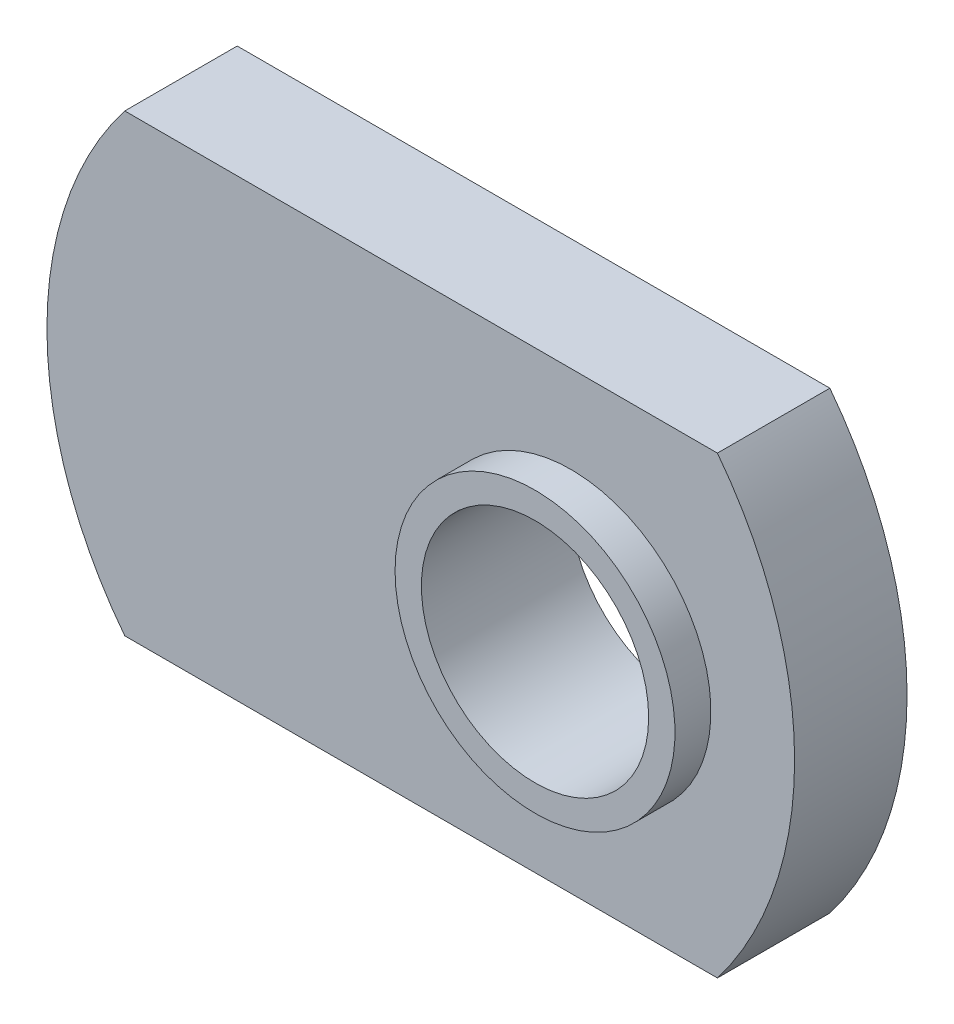
ISO-10303-21;
HEADER;
FILE_DESCRIPTION(('STEP AP214'),'2;1');
FILE_NAME('part.step','',(''),(''),'','','');
FILE_SCHEMA(('AUTOMOTIVE_DESIGN { 1 0 10303 214 1 1 1 1 }'));
ENDSEC;
DATA;
#1=APPLICATION_CONTEXT('core data for automotive mechanical design processes');
#2=APPLICATION_PROTOCOL_DEFINITION('international standard','automotive_design',2000,#1);
#3=PRODUCT_CONTEXT('',#1,'mechanical');
#4=PRODUCT('Part','Part','',(#3));
#5=PRODUCT_RELATED_PRODUCT_CATEGORY('part','',(#4));
#6=PRODUCT_DEFINITION_FORMATION('','',#4);
#7=PRODUCT_DEFINITION_CONTEXT('part definition',#1,'design');
#8=PRODUCT_DEFINITION('design','',#6,#7);
#9=PRODUCT_DEFINITION_SHAPE('','',#8);
#10=(LENGTH_UNIT() NAMED_UNIT(*) SI_UNIT(.MILLI.,.METRE.));
#11=(NAMED_UNIT(*) PLANE_ANGLE_UNIT() SI_UNIT($,.RADIAN.));
#12=(NAMED_UNIT(*) SI_UNIT($,.STERADIAN.) SOLID_ANGLE_UNIT());
#13=UNCERTAINTY_MEASURE_WITH_UNIT(LENGTH_MEASURE(1.E-05),#10,'distance_accuracy_value','');
#14=(GEOMETRIC_REPRESENTATION_CONTEXT(3) GLOBAL_UNCERTAINTY_ASSIGNED_CONTEXT((#13)) GLOBAL_UNIT_ASSIGNED_CONTEXT((#10,
#11,#12)) REPRESENTATION_CONTEXT('',''));
#15=CARTESIAN_POINT('',(0.,0.,0.));
#16=DIRECTION('',(0.,0.,1.));
#17=DIRECTION('',(1.,0.,0.));
#18=AXIS2_PLACEMENT_3D('',#15,#16,#17);
#19=CARTESIAN_POINT('',(-25.8993325996923,15.7042302686073,2.3876));
#20=DIRECTION('',(0.,0.,1.));
#21=DIRECTION('',(1.,0.,0.));
#22=AXIS2_PLACEMENT_3D('',#19,#20,#21);
#23=PLANE('',#22);
#24=CARTESIAN_POINT('',(-25.8993325996923,15.7042302686073,2.3876));
#25=DIRECTION('',(0.,0.,1.));
#26=DIRECTION('',(1.,0.,0.));
#27=AXIS2_PLACEMENT_3D('',#24,#25,#26);
#28=CIRCLE('',#27,7.9248);
#29=CARTESIAN_POINT('',(-19.6134612169802,10.8782302686073,2.3876));
#30=VERTEX_POINT('',#29);
#31=CARTESIAN_POINT('',(-19.6134612169802,20.5302302686073,2.3876));
#32=VERTEX_POINT('',#31);
#33=EDGE_CURVE('E85',#30,#32,#28,.T.);
#34=ORIENTED_EDGE('',*,*,#33,.T.);
#35=DIRECTION('',(-1.,0.,0.));
#36=VECTOR('',#35,1.);
#37=CARTESIAN_POINT('',(-32.1972365463616,20.5302302686073,2.3876));
#38=LINE('',#37,#36);
#39=CARTESIAN_POINT('',(-32.1972365463616,20.5302302686073,2.3876));
#40=VERTEX_POINT('',#39);
#41=EDGE_CURVE('E80',#32,#40,#38,.T.);
#42=ORIENTED_EDGE('',*,*,#41,.T.);
#43=CARTESIAN_POINT('',(-25.9755325996923,15.7042302686073,2.3876));
#44=DIRECTION('',(0.,0.,1.));
#45=DIRECTION('',(1.,0.,0.));
#46=AXIS2_PLACEMENT_3D('',#43,#44,#45);
#47=CIRCLE('',#46,7.874);
#48=CARTESIAN_POINT('',(-32.1972365463616,10.8782302686073,2.3876));
#49=VERTEX_POINT('',#48);
#50=EDGE_CURVE('E83',#40,#49,#47,.T.);
#51=ORIENTED_EDGE('',*,*,#50,.T.);
#52=DIRECTION('',(1.,0.,0.));
#53=VECTOR('',#52,1.);
#54=CARTESIAN_POINT('',(-32.1972365463616,10.8782302686073,2.3876));
#55=LINE('',#54,#53);
#56=EDGE_CURVE('E50',#49,#30,#55,.T.);
#57=ORIENTED_EDGE('',*,*,#56,.T.);
#58=EDGE_LOOP('',(#34,#42,#51,#57));
#59=FACE_BOUND('',#58,.T.);
#60=CARTESIAN_POINT('',(-22.7243325996923,15.7042302686073,2.3876));
#61=DIRECTION('',(0.,0.,1.));
#62=DIRECTION('',(1.,0.,0.));
#63=AXIS2_PLACEMENT_3D('',#60,#61,#62);
#64=CIRCLE('',#63,2.9718);
#65=CARTESIAN_POINT('',(-25.6961325996923,15.7042302686073,2.3876));
#66=VERTEX_POINT('',#65);
#67=EDGE_CURVE('E115',#66,#66,#64,.T.);
#68=ORIENTED_EDGE('',*,*,#67,.F.);
#69=EDGE_LOOP('',(#68));
#70=FACE_BOUND('',#69,.T.);
#71=ADVANCED_FACE('F33',(#59,#70),#23,.T.);
#72=CARTESIAN_POINT('',(-25.8993325996923,15.7042302686073,0.));
#73=DIRECTION('',(0.,0.,1.));
#74=DIRECTION('',(1.,0.,0.));
#75=AXIS2_PLACEMENT_3D('',#72,#73,#74);
#76=PLANE('',#75);
#77=CARTESIAN_POINT('',(-25.8993325996923,15.7042302686073,0.));
#78=DIRECTION('',(0.,0.,1.));
#79=DIRECTION('',(1.,0.,0.));
#80=AXIS2_PLACEMENT_3D('',#77,#78,#79);
#81=CIRCLE('',#80,7.9248);
#82=CARTESIAN_POINT('',(-19.6134612169802,10.8782302686073,0.));
#83=VERTEX_POINT('',#82);
#84=CARTESIAN_POINT('',(-19.6134612169802,20.5302302686073,0.));
#85=VERTEX_POINT('',#84);
#86=EDGE_CURVE('E97',#83,#85,#81,.T.);
#87=ORIENTED_EDGE('',*,*,#86,.F.);
#88=DIRECTION('',(1.,0.,0.));
#89=VECTOR('',#88,1.);
#90=CARTESIAN_POINT('',(-32.1972365463616,10.8782302686073,0.));
#91=LINE('',#90,#89);
#92=CARTESIAN_POINT('',(-32.1972365463616,10.8782302686073,0.));
#93=VERTEX_POINT('',#92);
#94=EDGE_CURVE('E73',#93,#83,#91,.T.);
#95=ORIENTED_EDGE('',*,*,#94,.F.);
#96=CARTESIAN_POINT('',(-25.9755325996923,15.7042302686073,0.));
#97=DIRECTION('',(0.,0.,1.));
#98=DIRECTION('',(1.,0.,0.));
#99=AXIS2_PLACEMENT_3D('',#96,#97,#98);
#100=CIRCLE('',#99,7.874);
#101=CARTESIAN_POINT('',(-32.1972365463616,20.5302302686073,0.));
#102=VERTEX_POINT('',#101);
#103=EDGE_CURVE('E67',#102,#93,#100,.T.);
#104=ORIENTED_EDGE('',*,*,#103,.F.);
#105=DIRECTION('',(-1.,0.,0.));
#106=VECTOR('',#105,1.);
#107=CARTESIAN_POINT('',(-32.1972365463616,20.5302302686073,0.));
#108=LINE('',#107,#106);
#109=EDGE_CURVE('E89',#85,#102,#108,.T.);
#110=ORIENTED_EDGE('',*,*,#109,.F.);
#111=EDGE_LOOP('',(#87,#95,#104,#110));
#112=FACE_BOUND('',#111,.T.);
#113=CARTESIAN_POINT('',(-22.7243325996923,15.7042302686073,0.));
#114=DIRECTION('',(0.,0.,1.));
#115=DIRECTION('',(1.,0.,0.));
#116=AXIS2_PLACEMENT_3D('',#113,#114,#115);
#117=CIRCLE('',#116,2.413);
#118=CARTESIAN_POINT('',(-20.3113325996923,15.7042302686073,0.));
#119=VERTEX_POINT('',#118);
#120=EDGE_CURVE('E100',#119,#119,#117,.T.);
#121=ORIENTED_EDGE('',*,*,#120,.T.);
#122=EDGE_LOOP('',(#121));
#123=FACE_BOUND('',#122,.T.);
#124=ADVANCED_FACE('F108',(#112,#123),#76,.F.);
#125=CARTESIAN_POINT('',(-25.8993325996923,15.7042302686073,2.3876));
#126=DIRECTION('',(0.,0.,-1.));
#127=DIRECTION('',(-1.,0.,0.));
#128=AXIS2_PLACEMENT_3D('',#125,#126,#127);
#129=CYLINDRICAL_SURFACE('',#128,7.9248);
#130=ORIENTED_EDGE('',*,*,#86,.T.);
#131=DIRECTION('',(0.,0.,-1.));
#132=VECTOR('',#131,1.);
#133=CARTESIAN_POINT('',(-19.6134612169802,20.5302302686073,2.3876));
#134=LINE('',#133,#132);
#135=EDGE_CURVE('E11',#32,#85,#134,.T.);
#136=ORIENTED_EDGE('',*,*,#135,.F.);
#137=ORIENTED_EDGE('',*,*,#33,.F.);
#138=DIRECTION('',(0.,0.,-1.));
#139=VECTOR('',#138,1.);
#140=CARTESIAN_POINT('',(-19.6134612169802,10.8782302686073,2.3876));
#141=LINE('',#140,#139);
#142=EDGE_CURVE('E93',#30,#83,#141,.T.);
#143=ORIENTED_EDGE('',*,*,#142,.T.);
#144=EDGE_LOOP('',(#130,#136,#137,#143));
#145=FACE_BOUND('',#144,.T.);
#146=ADVANCED_FACE('F35',(#145),#129,.T.);
#147=CARTESIAN_POINT('',(-32.1972365463616,20.5302302686073,2.3876));
#148=DIRECTION('',(0.,-1.,0.));
#149=DIRECTION('',(0.,0.,-1.));
#150=AXIS2_PLACEMENT_3D('',#147,#148,#149);
#151=PLANE('',#150);
#152=ORIENTED_EDGE('',*,*,#109,.T.);
#153=DIRECTION('',(0.,0.,-1.));
#154=VECTOR('',#153,1.);
#155=CARTESIAN_POINT('',(-32.1972365463616,20.5302302686073,2.3876));
#156=LINE('',#155,#154);
#157=EDGE_CURVE('E42',#40,#102,#156,.T.);
#158=ORIENTED_EDGE('',*,*,#157,.F.);
#159=ORIENTED_EDGE('',*,*,#41,.F.);
#160=ORIENTED_EDGE('',*,*,#135,.T.);
#161=EDGE_LOOP('',(#152,#158,#159,#160));
#162=FACE_BOUND('',#161,.T.);
#163=ADVANCED_FACE('F88',(#162),#151,.F.);
#164=CARTESIAN_POINT('',(-25.9755325996923,15.7042302686073,2.3876));
#165=DIRECTION('',(0.,0.,-1.));
#166=DIRECTION('',(-1.,0.,0.));
#167=AXIS2_PLACEMENT_3D('',#164,#165,#166);
#168=CYLINDRICAL_SURFACE('',#167,7.874);
#169=ORIENTED_EDGE('',*,*,#103,.T.);
#170=DIRECTION('',(0.,0.,-1.));
#171=VECTOR('',#170,1.);
#172=CARTESIAN_POINT('',(-32.1972365463616,10.8782302686073,2.3876));
#173=LINE('',#172,#171);
#174=EDGE_CURVE('E90',#49,#93,#173,.T.);
#175=ORIENTED_EDGE('',*,*,#174,.F.);
#176=ORIENTED_EDGE('',*,*,#50,.F.);
#177=ORIENTED_EDGE('',*,*,#157,.T.);
#178=EDGE_LOOP('',(#169,#175,#176,#177));
#179=FACE_BOUND('',#178,.T.);
#180=ADVANCED_FACE('F91',(#179),#168,.T.);
#181=CARTESIAN_POINT('',(-32.1972365463616,10.8782302686073,2.3876));
#182=DIRECTION('',(0.,1.,0.));
#183=DIRECTION('',(0.,0.,1.));
#184=AXIS2_PLACEMENT_3D('',#181,#182,#183);
#185=PLANE('',#184);
#186=ORIENTED_EDGE('',*,*,#94,.T.);
#187=ORIENTED_EDGE('',*,*,#142,.F.);
#188=ORIENTED_EDGE('',*,*,#56,.F.);
#189=ORIENTED_EDGE('',*,*,#174,.T.);
#190=EDGE_LOOP('',(#186,#187,#188,#189));
#191=FACE_BOUND('',#190,.T.);
#192=ADVANCED_FACE('F105',(#191),#185,.F.);
#193=CARTESIAN_POINT('',(-22.7243325996923,15.7042302686073,2.3876));
#194=DIRECTION('',(0.,0.,-1.));
#195=DIRECTION('',(-1.,0.,0.));
#196=AXIS2_PLACEMENT_3D('',#193,#194,#195);
#197=CYLINDRICAL_SURFACE('',#196,2.413);
#198=ORIENTED_EDGE('',*,*,#120,.F.);
#199=EDGE_LOOP('',(#198));
#200=FACE_BOUND('',#199,.T.);
#201=CARTESIAN_POINT('',(-22.7243325996923,15.7042302686073,3.1496));
#202=DIRECTION('',(0.,0.,1.));
#203=DIRECTION('',(1.,0.,0.));
#204=AXIS2_PLACEMENT_3D('',#201,#202,#203);
#205=CIRCLE('',#204,2.413);
#206=CARTESIAN_POINT('',(-20.3113325996923,15.7042302686073,3.1496));
#207=VERTEX_POINT('',#206);
#208=EDGE_CURVE('E118',#207,#207,#205,.T.);
#209=ORIENTED_EDGE('',*,*,#208,.T.);
#210=EDGE_LOOP('',(#209));
#211=FACE_BOUND('',#210,.T.);
#212=ADVANCED_FACE('F124',(#200,#211),#197,.F.);
#213=CARTESIAN_POINT('',(-22.7243325996923,15.7042302686073,3.1496));
#214=DIRECTION('',(0.,0.,1.));
#215=DIRECTION('',(1.,0.,0.));
#216=AXIS2_PLACEMENT_3D('',#213,#214,#215);
#217=PLANE('',#216);
#218=CARTESIAN_POINT('',(-22.7243325996923,15.7042302686073,3.1496));
#219=DIRECTION('',(0.,0.,1.));
#220=DIRECTION('',(1.,0.,0.));
#221=AXIS2_PLACEMENT_3D('',#218,#219,#220);
#222=CIRCLE('',#221,2.9718);
#223=CARTESIAN_POINT('',(-25.6961325996923,15.7042302686073,3.1496));
#224=VERTEX_POINT('',#223);
#225=EDGE_CURVE('E114',#224,#224,#222,.T.);
#226=ORIENTED_EDGE('',*,*,#225,.T.);
#227=EDGE_LOOP('',(#226));
#228=FACE_BOUND('',#227,.T.);
#229=ORIENTED_EDGE('',*,*,#208,.F.);
#230=EDGE_LOOP('',(#229));
#231=FACE_BOUND('',#230,.T.);
#232=ADVANCED_FACE('F126',(#228,#231),#217,.T.);
#233=CARTESIAN_POINT('',(-22.7243325996923,15.7042302686073,3.1496));
#234=DIRECTION('',(0.,0.,-1.));
#235=DIRECTION('',(-1.,0.,0.));
#236=AXIS2_PLACEMENT_3D('',#233,#234,#235);
#237=CYLINDRICAL_SURFACE('',#236,2.9718);
#238=CARTESIAN_POINT('',(-25.6961325996923,15.7042302686073,3.1496));
#239=CARTESIAN_POINT('',(-25.6961325996923,15.7042302686073,3.1416625));
#240=CARTESIAN_POINT('',(-25.6961325996923,15.7042302686073,3.133725));
#241=CARTESIAN_POINT('',(-25.6961325996923,15.7042302686073,3.11785));
#242=CARTESIAN_POINT('',(-25.6961325996923,15.7042302686073,3.1099125));
#243=CARTESIAN_POINT('',(-25.6961325996923,15.7042302686073,3.0940375));
#244=CARTESIAN_POINT('',(-25.6961325996923,15.7042302686073,3.0861));
#245=CARTESIAN_POINT('',(-25.6961325996923,15.7042302686073,3.070225));
#246=CARTESIAN_POINT('',(-25.6961325996923,15.7042302686073,3.0622875));
#247=CARTESIAN_POINT('',(-25.6961325996923,15.7042302686073,3.0464125));
#248=CARTESIAN_POINT('',(-25.6961325996923,15.7042302686073,3.038475));
#249=CARTESIAN_POINT('',(-25.6961325996923,15.7042302686073,3.0226));
#250=CARTESIAN_POINT('',(-25.6961325996923,15.7042302686073,3.0146625));
#251=CARTESIAN_POINT('',(-25.6961325996923,15.7042302686073,2.9987875));
#252=CARTESIAN_POINT('',(-25.6961325996923,15.7042302686073,2.99085));
#253=CARTESIAN_POINT('',(-25.6961325996923,15.7042302686073,2.974975));
#254=CARTESIAN_POINT('',(-25.6961325996923,15.7042302686073,2.9670375));
#255=CARTESIAN_POINT('',(-25.6961325996923,15.7042302686073,2.9511625));
#256=CARTESIAN_POINT('',(-25.6961325996923,15.7042302686073,2.943225));
#257=CARTESIAN_POINT('',(-25.6961325996923,15.7042302686073,2.92735));
#258=CARTESIAN_POINT('',(-25.6961325996923,15.7042302686073,2.9194125));
#259=CARTESIAN_POINT('',(-25.6961325996923,15.7042302686073,2.9035375));
#260=CARTESIAN_POINT('',(-25.6961325996923,15.7042302686073,2.8956));
#261=CARTESIAN_POINT('',(-25.6961325996923,15.7042302686073,2.879725));
#262=CARTESIAN_POINT('',(-25.6961325996923,15.7042302686073,2.8717875));
#263=CARTESIAN_POINT('',(-25.6961325996923,15.7042302686073,2.8559125));
#264=CARTESIAN_POINT('',(-25.6961325996923,15.7042302686073,2.847975));
#265=CARTESIAN_POINT('',(-25.6961325996923,15.7042302686073,2.8321));
#266=CARTESIAN_POINT('',(-25.6961325996923,15.7042302686073,2.8241625));
#267=CARTESIAN_POINT('',(-25.6961325996923,15.7042302686073,2.8082875));
#268=CARTESIAN_POINT('',(-25.6961325996923,15.7042302686073,2.80035));
#269=CARTESIAN_POINT('',(-25.6961325996923,15.7042302686073,2.784475));
#270=CARTESIAN_POINT('',(-25.6961325996923,15.7042302686073,2.7765375));
#271=CARTESIAN_POINT('',(-25.6961325996923,15.7042302686073,2.7606625));
#272=CARTESIAN_POINT('',(-25.6961325996923,15.7042302686073,2.752725));
#273=CARTESIAN_POINT('',(-25.6961325996923,15.7042302686073,2.73685));
#274=CARTESIAN_POINT('',(-25.6961325996923,15.7042302686073,2.7289125));
#275=CARTESIAN_POINT('',(-25.6961325996923,15.7042302686073,2.7130375));
#276=CARTESIAN_POINT('',(-25.6961325996923,15.7042302686073,2.7051));
#277=CARTESIAN_POINT('',(-25.6961325996923,15.7042302686073,2.689225));
#278=CARTESIAN_POINT('',(-25.6961325996923,15.7042302686073,2.6812875));
#279=CARTESIAN_POINT('',(-25.6961325996923,15.7042302686073,2.6654125));
#280=CARTESIAN_POINT('',(-25.6961325996923,15.7042302686073,2.657475));
#281=CARTESIAN_POINT('',(-25.6961325996923,15.7042302686073,2.6416));
#282=CARTESIAN_POINT('',(-25.6961325996923,15.7042302686073,2.6336625));
#283=CARTESIAN_POINT('',(-25.6961325996923,15.7042302686073,2.6177875));
#284=CARTESIAN_POINT('',(-25.6961325996923,15.7042302686073,2.60985));
#285=CARTESIAN_POINT('',(-25.6961325996923,15.7042302686073,2.593975));
#286=CARTESIAN_POINT('',(-25.6961325996923,15.7042302686073,2.5860375));
#287=CARTESIAN_POINT('',(-25.6961325996923,15.7042302686073,2.5701625));
#288=CARTESIAN_POINT('',(-25.6961325996923,15.7042302686073,2.562225));
#289=CARTESIAN_POINT('',(-25.6961325996923,15.7042302686073,2.54635));
#290=CARTESIAN_POINT('',(-25.6961325996923,15.7042302686073,2.5384125));
#291=CARTESIAN_POINT('',(-25.6961325996923,15.7042302686073,2.5225375));
#292=CARTESIAN_POINT('',(-25.6961325996923,15.7042302686073,2.5146));
#293=CARTESIAN_POINT('',(-25.6961325996923,15.7042302686073,2.498725));
#294=CARTESIAN_POINT('',(-25.6961325996923,15.7042302686073,2.4907875));
#295=CARTESIAN_POINT('',(-25.6961325996923,15.7042302686073,2.4749125));
#296=CARTESIAN_POINT('',(-25.6961325996923,15.7042302686073,2.466975));
#297=CARTESIAN_POINT('',(-25.6961325996923,15.7042302686073,2.4511));
#298=CARTESIAN_POINT('',(-25.6961325996923,15.7042302686073,2.4431625));
#299=CARTESIAN_POINT('',(-25.6961325996923,15.7042302686073,2.4272875));
#300=CARTESIAN_POINT('',(-25.6961325996923,15.7042302686073,2.41935));
#301=CARTESIAN_POINT('',(-25.6961325996923,15.7042302686073,2.403475));
#302=CARTESIAN_POINT('',(-25.6961325996923,15.7042302686073,2.3955375));
#303=CARTESIAN_POINT('',(-25.6961325996923,15.7042302686073,2.3876));
#304=B_SPLINE_CURVE_WITH_KNOTS('',3,(#238,#239,#240,#241,#242,#243,#244,#245,#246,#247,#248,
#249,#250,#251,#252,#253,#254,#255,#256,#257,#258,#259,#260,#261,#262,#263,#264,#265,#266,#267,
#268,#269,#270,#271,#272,#273,#274,#275,#276,#277,#278,#279,#280,#281,#282,#283,#284,#285,#286,
#287,#288,#289,#290,#291,#292,#293,#294,#295,#296,#297,#298,#299,#300,#301,#302,#303),
.UNSPECIFIED.,.F.,.F.,(4,2,2,2,2,2,2,2,2,2,2,2,2,2,2,2,2,2,2,2,2,2,2,2,2,2,2,2,2,2,2,2,4),(0.,
0.0238125000000004,0.0476250000000004,0.0714375000000003,0.0952500000000003,0.1190625,0.142875,
0.1666875,0.1905,0.2143125,0.238125,0.2619375,0.28575,0.3095625,0.333375,0.3571875,0.381,
0.4048125,0.428625,0.4524375,0.476250000000001,0.5000625,0.523875,0.5476875,0.5715,0.5953125,
0.619125,0.6429375,0.66675,0.690562500000001,0.714375,0.738187500000001,0.762000000000001),.UNSPECIFIED.);
#305=EDGE_CURVE('BSEAM128',#224,#66,#304,.T.);
#306=ORIENTED_EDGE('',*,*,#225,.F.);
#307=ORIENTED_EDGE('',*,*,#67,.T.);
#308=ORIENTED_EDGE('',*,*,#305,.T.);
#309=ORIENTED_EDGE('',*,*,#305,.F.);
#310=EDGE_LOOP('',(#306,#308,#307,#309));
#311=FACE_BOUND('',#310,.T.);
#312=ADVANCED_FACE('F128',(#311),#237,.T.);
#313=CLOSED_SHELL('',(#71,#124,#146,#163,#180,#192,#212,#232,#312));
#314=MANIFOLD_SOLID_BREP('B2',#313);
#315=ADVANCED_BREP_SHAPE_REPRESENTATION('',(#18,#314),#14);
#316=SHAPE_DEFINITION_REPRESENTATION(#9,#315);
ENDSEC;
END-ISO-10303-21;
